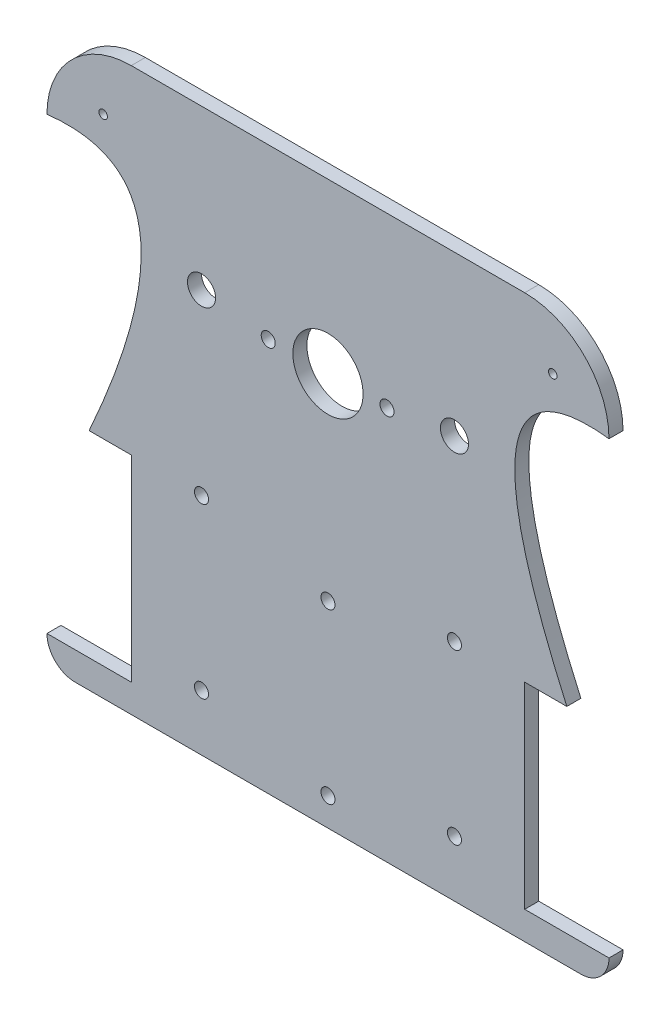
ISO-10303-21;
HEADER;
FILE_DESCRIPTION(('STEP AP214'),'2;1');
FILE_NAME('part.step','',(''),(''),'','','');
FILE_SCHEMA(('AUTOMOTIVE_DESIGN { 1 0 10303 214 1 1 1 1 }'));
ENDSEC;
DATA;
#1=APPLICATION_CONTEXT('core data for automotive mechanical design processes');
#2=APPLICATION_PROTOCOL_DEFINITION('international standard','automotive_design',2000,#1);
#3=PRODUCT_CONTEXT('',#1,'mechanical');
#4=PRODUCT('Part','Part','',(#3));
#5=PRODUCT_RELATED_PRODUCT_CATEGORY('part','',(#4));
#6=PRODUCT_DEFINITION_FORMATION('','',#4);
#7=PRODUCT_DEFINITION_CONTEXT('part definition',#1,'design');
#8=PRODUCT_DEFINITION('design','',#6,#7);
#9=PRODUCT_DEFINITION_SHAPE('','',#8);
#10=(LENGTH_UNIT() NAMED_UNIT(*) SI_UNIT(.MILLI.,.METRE.));
#11=(NAMED_UNIT(*) PLANE_ANGLE_UNIT() SI_UNIT($,.RADIAN.));
#12=(NAMED_UNIT(*) SI_UNIT($,.STERADIAN.) SOLID_ANGLE_UNIT());
#13=UNCERTAINTY_MEASURE_WITH_UNIT(LENGTH_MEASURE(1.E-05),#10,'distance_accuracy_value','');
#14=(GEOMETRIC_REPRESENTATION_CONTEXT(3) GLOBAL_UNCERTAINTY_ASSIGNED_CONTEXT((#13)) GLOBAL_UNIT_ASSIGNED_CONTEXT((#10,
#11,#12)) REPRESENTATION_CONTEXT('',''));
#15=CARTESIAN_POINT('',(0.,0.,0.));
#16=DIRECTION('',(0.,0.,1.));
#17=DIRECTION('',(1.,0.,0.));
#18=AXIS2_PLACEMENT_3D('',#15,#16,#17);
#19=CARTESIAN_POINT('',(90.,-90.,5.));
#20=DIRECTION('',(0.,0.,-1.));
#21=DIRECTION('',(-1.,0.,0.));
#22=AXIS2_PLACEMENT_3D('',#19,#20,#21);
#23=CYLINDRICAL_SURFACE('',#22,9.99999999999999);
#24=CARTESIAN_POINT('',(90.,-90.,0.));
#25=DIRECTION('',(0.,0.,1.));
#26=DIRECTION('',(1.,0.,0.));
#27=AXIS2_PLACEMENT_3D('',#24,#25,#26);
#28=CIRCLE('',#27,9.99999999999999);
#29=CARTESIAN_POINT('',(89.9999999999999,-100.,0.));
#30=VERTEX_POINT('',#29);
#31=CARTESIAN_POINT('',(100.,-90.,0.));
#32=VERTEX_POINT('',#31);
#33=EDGE_CURVE('E172',#30,#32,#28,.T.);
#34=ORIENTED_EDGE('',*,*,#33,.T.);
#35=DIRECTION('',(0.,0.,-1.));
#36=VECTOR('',#35,1.);
#37=CARTESIAN_POINT('',(100.,-89.9999999999999,5.));
#38=LINE('',#37,#36);
#39=CARTESIAN_POINT('',(100.,-90.,5.));
#40=VERTEX_POINT('',#39);
#41=EDGE_CURVE('E11',#40,#32,#38,.T.);
#42=ORIENTED_EDGE('',*,*,#41,.F.);
#43=CARTESIAN_POINT('',(90.,-90.,5.));
#44=DIRECTION('',(0.,0.,1.));
#45=DIRECTION('',(1.,0.,0.));
#46=AXIS2_PLACEMENT_3D('',#43,#44,#45);
#47=CIRCLE('',#46,9.99999999999999);
#48=CARTESIAN_POINT('',(89.9999999999999,-100.,5.));
#49=VERTEX_POINT('',#48);
#50=EDGE_CURVE('E194',#49,#40,#47,.T.);
#51=ORIENTED_EDGE('',*,*,#50,.F.);
#52=DIRECTION('',(0.,0.,-1.));
#53=VECTOR('',#52,1.);
#54=CARTESIAN_POINT('',(89.9999999999999,-100.,5.));
#55=LINE('',#54,#53);
#56=EDGE_CURVE('E209',#49,#30,#55,.T.);
#57=ORIENTED_EDGE('',*,*,#56,.T.);
#58=EDGE_LOOP('',(#34,#42,#51,#57));
#59=FACE_BOUND('',#58,.T.);
#60=ADVANCED_FACE('F33',(#59),#23,.T.);
#61=CARTESIAN_POINT('',(70.,70.,5.));
#62=DIRECTION('',(0.,0.,-1.));
#63=DIRECTION('',(-1.,0.,0.));
#64=AXIS2_PLACEMENT_3D('',#61,#62,#63);
#65=CYLINDRICAL_SURFACE('',#64,30.);
#66=CARTESIAN_POINT('',(70.,70.,0.));
#67=DIRECTION('',(0.,0.,1.));
#68=DIRECTION('',(-1.,0.,0.));
#69=AXIS2_PLACEMENT_3D('',#66,#67,#68);
#70=CIRCLE('',#69,30.);
#71=CARTESIAN_POINT('',(100.,69.9999999999998,0.));
#72=VERTEX_POINT('',#71);
#73=CARTESIAN_POINT('',(69.9999999999998,100.,0.));
#74=VERTEX_POINT('',#73);
#75=EDGE_CURVE('E146',#72,#74,#70,.T.);
#76=ORIENTED_EDGE('',*,*,#75,.T.);
#77=DIRECTION('',(0.,0.,-1.));
#78=VECTOR('',#77,1.);
#79=CARTESIAN_POINT('',(69.9999999999998,100.,5.));
#80=LINE('',#79,#78);
#81=CARTESIAN_POINT('',(69.9999999999998,100.,5.));
#82=VERTEX_POINT('',#81);
#83=EDGE_CURVE('E234',#82,#74,#80,.T.);
#84=ORIENTED_EDGE('',*,*,#83,.F.);
#85=CARTESIAN_POINT('',(70.,70.,5.));
#86=DIRECTION('',(0.,0.,1.));
#87=DIRECTION('',(-1.,0.,0.));
#88=AXIS2_PLACEMENT_3D('',#85,#86,#87);
#89=CIRCLE('',#88,30.);
#90=CARTESIAN_POINT('',(100.,69.9999999999998,5.));
#91=VERTEX_POINT('',#90);
#92=EDGE_CURVE('E197',#91,#82,#89,.T.);
#93=ORIENTED_EDGE('',*,*,#92,.F.);
#94=DIRECTION('',(0.,0.,-1.));
#95=VECTOR('',#94,1.);
#96=CARTESIAN_POINT('',(100.,69.9999999999998,5.));
#97=LINE('',#96,#95);
#98=EDGE_CURVE('E40',#91,#72,#97,.T.);
#99=ORIENTED_EDGE('',*,*,#98,.T.);
#100=EDGE_LOOP('',(#76,#84,#93,#99));
#101=FACE_BOUND('',#100,.T.);
#102=ADVANCED_FACE('F238',(#101),#65,.T.);
#103=CARTESIAN_POINT('',(-69.9999999999998,100.,5.));
#104=DIRECTION('',(0.,-1.,0.));
#105=DIRECTION('',(0.,0.,-1.));
#106=AXIS2_PLACEMENT_3D('',#103,#104,#105);
#107=PLANE('',#106);
#108=DIRECTION('',(-1.,0.,0.));
#109=VECTOR('',#108,1.);
#110=CARTESIAN_POINT('',(-69.9999999999998,100.,0.));
#111=LINE('',#110,#109);
#112=CARTESIAN_POINT('',(-69.9999999999998,100.,0.));
#113=VERTEX_POINT('',#112);
#114=EDGE_CURVE('E213',#74,#113,#111,.T.);
#115=ORIENTED_EDGE('',*,*,#114,.T.);
#116=DIRECTION('',(0.,0.,-1.));
#117=VECTOR('',#116,1.);
#118=CARTESIAN_POINT('',(-69.9999999999998,100.,5.));
#119=LINE('',#118,#117);
#120=CARTESIAN_POINT('',(-69.9999999999998,100.,5.));
#121=VERTEX_POINT('',#120);
#122=EDGE_CURVE('E231',#121,#113,#119,.T.);
#123=ORIENTED_EDGE('',*,*,#122,.F.);
#124=DIRECTION('',(-1.,0.,0.));
#125=VECTOR('',#124,1.);
#126=CARTESIAN_POINT('',(-69.9999999999998,100.,5.));
#127=LINE('',#126,#125);
#128=EDGE_CURVE('E200',#82,#121,#127,.T.);
#129=ORIENTED_EDGE('',*,*,#128,.F.);
#130=ORIENTED_EDGE('',*,*,#83,.T.);
#131=EDGE_LOOP('',(#115,#123,#129,#130));
#132=FACE_BOUND('',#131,.T.);
#133=ADVANCED_FACE('F309',(#132),#107,.F.);
#134=CARTESIAN_POINT('',(-70.,70.,5.));
#135=DIRECTION('',(0.,0.,-1.));
#136=DIRECTION('',(-1.,0.,0.));
#137=AXIS2_PLACEMENT_3D('',#134,#135,#136);
#138=CYLINDRICAL_SURFACE('',#137,30.);
#139=CARTESIAN_POINT('',(-70.,70.,0.));
#140=DIRECTION('',(0.,0.,1.));
#141=DIRECTION('',(-1.,0.,0.));
#142=AXIS2_PLACEMENT_3D('',#139,#140,#141);
#143=CIRCLE('',#142,30.);
#144=CARTESIAN_POINT('',(-100.,69.9999999999998,0.));
#145=VERTEX_POINT('',#144);
#146=EDGE_CURVE('E215',#113,#145,#143,.T.);
#147=ORIENTED_EDGE('',*,*,#146,.T.);
#148=DIRECTION('',(0.,0.,-1.));
#149=VECTOR('',#148,1.);
#150=CARTESIAN_POINT('',(-100.,69.9999999999998,5.));
#151=LINE('',#150,#149);
#152=CARTESIAN_POINT('',(-100.,69.9999999999998,5.));
#153=VERTEX_POINT('',#152);
#154=EDGE_CURVE('E229',#153,#145,#151,.T.);
#155=ORIENTED_EDGE('',*,*,#154,.F.);
#156=CARTESIAN_POINT('',(-70.,70.,5.));
#157=DIRECTION('',(0.,0.,1.));
#158=DIRECTION('',(-1.,0.,0.));
#159=AXIS2_PLACEMENT_3D('',#156,#157,#158);
#160=CIRCLE('',#159,30.);
#161=EDGE_CURVE('E202',#121,#153,#160,.T.);
#162=ORIENTED_EDGE('',*,*,#161,.F.);
#163=ORIENTED_EDGE('',*,*,#122,.T.);
#164=EDGE_LOOP('',(#147,#155,#162,#163));
#165=FACE_BOUND('',#164,.T.);
#166=ADVANCED_FACE('F305',(#165),#138,.T.);
#167=CARTESIAN_POINT('',(-90.,-90.,5.));
#168=DIRECTION('',(0.,0.,-1.));
#169=DIRECTION('',(-1.,0.,0.));
#170=AXIS2_PLACEMENT_3D('',#167,#168,#169);
#171=CYLINDRICAL_SURFACE('',#170,9.99999999999999);
#172=CARTESIAN_POINT('',(-90.,-90.,0.));
#173=DIRECTION('',(0.,0.,1.));
#174=DIRECTION('',(-1.,0.,0.));
#175=AXIS2_PLACEMENT_3D('',#172,#173,#174);
#176=CIRCLE('',#175,9.99999999999999);
#177=CARTESIAN_POINT('',(-99.9999999999999,-90.,0.));
#178=VERTEX_POINT('',#177);
#179=CARTESIAN_POINT('',(-89.9999999999999,-100.,0.));
#180=VERTEX_POINT('',#179);
#181=EDGE_CURVE('E218',#178,#180,#176,.T.);
#182=ORIENTED_EDGE('',*,*,#181,.T.);
#183=DIRECTION('',(0.,0.,-1.));
#184=VECTOR('',#183,1.);
#185=CARTESIAN_POINT('',(-89.9999999999999,-100.,5.));
#186=LINE('',#185,#184);
#187=CARTESIAN_POINT('',(-89.9999999999999,-100.,5.));
#188=VERTEX_POINT('',#187);
#189=EDGE_CURVE('E223',#188,#180,#186,.T.);
#190=ORIENTED_EDGE('',*,*,#189,.F.);
#191=CARTESIAN_POINT('',(-90.,-90.,5.));
#192=DIRECTION('',(0.,0.,1.));
#193=DIRECTION('',(-1.,0.,0.));
#194=AXIS2_PLACEMENT_3D('',#191,#192,#193);
#195=CIRCLE('',#194,9.99999999999999);
#196=CARTESIAN_POINT('',(-99.9999999999999,-90.,5.));
#197=VERTEX_POINT('',#196);
#198=EDGE_CURVE('E205',#197,#188,#195,.T.);
#199=ORIENTED_EDGE('',*,*,#198,.F.);
#200=DIRECTION('',(0.,0.,-1.));
#201=VECTOR('',#200,1.);
#202=CARTESIAN_POINT('',(-100.,-90.,5.));
#203=LINE('',#202,#201);
#204=EDGE_CURVE('E226',#197,#178,#203,.T.);
#205=ORIENTED_EDGE('',*,*,#204,.T.);
#206=EDGE_LOOP('',(#182,#190,#199,#205));
#207=FACE_BOUND('',#206,.T.);
#208=ADVANCED_FACE('F301',(#207),#171,.T.);
#209=CARTESIAN_POINT('',(-89.9999999999999,-100.,5.));
#210=DIRECTION('',(0.,1.,0.));
#211=DIRECTION('',(0.,0.,1.));
#212=AXIS2_PLACEMENT_3D('',#209,#210,#211);
#213=PLANE('',#212);
#214=DIRECTION('',(1.,0.,0.));
#215=VECTOR('',#214,1.);
#216=CARTESIAN_POINT('',(-89.9999999999999,-100.,0.));
#217=LINE('',#216,#215);
#218=EDGE_CURVE('E198',#180,#30,#217,.T.);
#219=ORIENTED_EDGE('',*,*,#218,.T.);
#220=ORIENTED_EDGE('',*,*,#56,.F.);
#221=DIRECTION('',(1.,0.,0.));
#222=VECTOR('',#221,1.);
#223=CARTESIAN_POINT('',(-89.9999999999999,-100.,5.));
#224=LINE('',#223,#222);
#225=EDGE_CURVE('E207',#188,#49,#224,.T.);
#226=ORIENTED_EDGE('',*,*,#225,.F.);
#227=ORIENTED_EDGE('',*,*,#189,.T.);
#228=EDGE_LOOP('',(#219,#220,#226,#227));
#229=FACE_BOUND('',#228,.T.);
#230=ADVANCED_FACE('F294',(#229),#213,.F.);
#231=CARTESIAN_POINT('',(90.,-90.,5.));
#232=DIRECTION('',(0.,0.,1.));
#233=DIRECTION('',(1.,0.,0.));
#234=AXIS2_PLACEMENT_3D('',#231,#232,#233);
#235=PLANE('',#234);
#236=CARTESIAN_POINT('',(-80.,80.,5.));
#237=DIRECTION('',(0.,0.,1.));
#238=DIRECTION('',(1.,0.,0.));
#239=AXIS2_PLACEMENT_3D('',#236,#237,#238);
#240=CIRCLE('',#239,1.5);
#241=CARTESIAN_POINT('',(-78.5,80.,5.));
#242=VERTEX_POINT('',#241);
#243=EDGE_CURVE('E417',#242,#242,#240,.T.);
#244=ORIENTED_EDGE('',*,*,#243,.F.);
#245=EDGE_LOOP('',(#244));
#246=FACE_BOUND('',#245,.T.);
#247=CARTESIAN_POINT('',(80.,80.,5.));
#248=DIRECTION('',(0.,0.,1.));
#249=DIRECTION('',(1.,0.,0.));
#250=AXIS2_PLACEMENT_3D('',#247,#248,#249);
#251=CIRCLE('',#250,1.5);
#252=CARTESIAN_POINT('',(81.5,80.,5.));
#253=VERTEX_POINT('',#252);
#254=EDGE_CURVE('E411',#253,#253,#251,.T.);
#255=ORIENTED_EDGE('',*,*,#254,.F.);
#256=EDGE_LOOP('',(#255));
#257=FACE_BOUND('',#256,.T.);
#258=CARTESIAN_POINT('',(21.,40.,5.));
#259=DIRECTION('',(0.,0.,-1.));
#260=DIRECTION('',(-1.,0.,0.));
#261=AXIS2_PLACEMENT_3D('',#258,#259,#260);
#262=CIRCLE('',#261,2.5);
#263=CARTESIAN_POINT('',(18.5,40.,5.));
#264=VERTEX_POINT('',#263);
#265=EDGE_CURVE('E390',#264,#264,#262,.T.);
#266=ORIENTED_EDGE('',*,*,#265,.T.);
#267=EDGE_LOOP('',(#266));
#268=FACE_BOUND('',#267,.T.);
#269=CARTESIAN_POINT('',(-21.26,40.,5.));
#270=DIRECTION('',(0.,0.,-1.));
#271=DIRECTION('',(-1.,0.,0.));
#272=AXIS2_PLACEMENT_3D('',#269,#270,#271);
#273=CIRCLE('',#272,2.5);
#274=CARTESIAN_POINT('',(-23.76,40.,5.));
#275=VERTEX_POINT('',#274);
#276=EDGE_CURVE('E403',#275,#275,#273,.T.);
#277=ORIENTED_EDGE('',*,*,#276,.T.);
#278=EDGE_LOOP('',(#277));
#279=FACE_BOUND('',#278,.T.);
#280=CARTESIAN_POINT('',(0.,40.,5.));
#281=DIRECTION('',(0.,0.,-1.));
#282=DIRECTION('',(-1.,0.,0.));
#283=AXIS2_PLACEMENT_3D('',#280,#281,#282);
#284=CIRCLE('',#283,12.5);
#285=CARTESIAN_POINT('',(-12.5,40.,5.));
#286=VERTEX_POINT('',#285);
#287=EDGE_CURVE('E396',#286,#286,#284,.T.);
#288=ORIENTED_EDGE('',*,*,#287,.T.);
#289=EDGE_LOOP('',(#288));
#290=FACE_BOUND('',#289,.T.);
#291=CARTESIAN_POINT('',(0.,-90.,5.));
#292=DIRECTION('',(0.,0.,1.));
#293=DIRECTION('',(1.,0.,0.));
#294=AXIS2_PLACEMENT_3D('',#291,#292,#293);
#295=CIRCLE('',#294,2.5);
#296=CARTESIAN_POINT('',(2.5,-90.,5.));
#297=VERTEX_POINT('',#296);
#298=EDGE_CURVE('E387',#297,#297,#295,.T.);
#299=ORIENTED_EDGE('',*,*,#298,.F.);
#300=EDGE_LOOP('',(#299));
#301=FACE_BOUND('',#300,.T.);
#302=CARTESIAN_POINT('',(-45.,43.3509985670117,5.));
#303=DIRECTION('',(0.,0.,1.));
#304=DIRECTION('',(1.,0.,0.));
#305=AXIS2_PLACEMENT_3D('',#302,#303,#304);
#306=CIRCLE('',#305,5.);
#307=CARTESIAN_POINT('',(-40.,43.3509985670117,5.));
#308=VERTEX_POINT('',#307);
#309=EDGE_CURVE('E363',#308,#308,#306,.T.);
#310=ORIENTED_EDGE('',*,*,#309,.F.);
#311=EDGE_LOOP('',(#310));
#312=FACE_BOUND('',#311,.T.);
#313=CARTESIAN_POINT('',(-45.,-20.,5.));
#314=DIRECTION('',(0.,0.,1.));
#315=DIRECTION('',(-1.,0.,0.));
#316=AXIS2_PLACEMENT_3D('',#313,#314,#315);
#317=CIRCLE('',#316,2.5);
#318=CARTESIAN_POINT('',(-47.5,-20.,5.));
#319=VERTEX_POINT('',#318);
#320=EDGE_CURVE('E370',#319,#319,#317,.T.);
#321=ORIENTED_EDGE('',*,*,#320,.F.);
#322=EDGE_LOOP('',(#321));
#323=FACE_BOUND('',#322,.T.);
#324=CARTESIAN_POINT('',(45.,-20.,5.));
#325=DIRECTION('',(0.,0.,1.));
#326=DIRECTION('',(-1.,0.,0.));
#327=AXIS2_PLACEMENT_3D('',#324,#325,#326);
#328=CIRCLE('',#327,2.5);
#329=CARTESIAN_POINT('',(42.5,-20.,5.));
#330=VERTEX_POINT('',#329);
#331=EDGE_CURVE('E351',#330,#330,#328,.T.);
#332=ORIENTED_EDGE('',*,*,#331,.F.);
#333=EDGE_LOOP('',(#332));
#334=FACE_BOUND('',#333,.T.);
#335=CARTESIAN_POINT('',(-45.,-80.,5.));
#336=DIRECTION('',(0.,0.,1.));
#337=DIRECTION('',(1.,0.,0.));
#338=AXIS2_PLACEMENT_3D('',#335,#336,#337);
#339=CIRCLE('',#338,2.5);
#340=CARTESIAN_POINT('',(-42.5,-80.,5.));
#341=VERTEX_POINT('',#340);
#342=EDGE_CURVE('E358',#341,#341,#339,.T.);
#343=ORIENTED_EDGE('',*,*,#342,.F.);
#344=EDGE_LOOP('',(#343));
#345=FACE_BOUND('',#344,.T.);
#346=CARTESIAN_POINT('',(45.,43.3509985670117,5.));
#347=DIRECTION('',(0.,0.,1.));
#348=DIRECTION('',(-1.,0.,0.));
#349=AXIS2_PLACEMENT_3D('',#346,#347,#348);
#350=CIRCLE('',#349,5.);
#351=CARTESIAN_POINT('',(40.,43.3509985670117,5.));
#352=VERTEX_POINT('',#351);
#353=EDGE_CURVE('E382',#352,#352,#350,.T.);
#354=ORIENTED_EDGE('',*,*,#353,.F.);
#355=EDGE_LOOP('',(#354));
#356=FACE_BOUND('',#355,.T.);
#357=CARTESIAN_POINT('',(0.,-30.,5.));
#358=DIRECTION('',(0.,0.,1.));
#359=DIRECTION('',(1.,0.,0.));
#360=AXIS2_PLACEMENT_3D('',#357,#358,#359);
#361=CIRCLE('',#360,2.5);
#362=CARTESIAN_POINT('',(2.5,-30.,5.));
#363=VERTEX_POINT('',#362);
#364=EDGE_CURVE('E375',#363,#363,#361,.T.);
#365=ORIENTED_EDGE('',*,*,#364,.F.);
#366=EDGE_LOOP('',(#365));
#367=FACE_BOUND('',#366,.T.);
#368=CARTESIAN_POINT('',(45.,-80.,5.));
#369=DIRECTION('',(0.,0.,1.));
#370=DIRECTION('',(1.,0.,0.));
#371=AXIS2_PLACEMENT_3D('',#368,#369,#370);
#372=CIRCLE('',#371,2.5);
#373=CARTESIAN_POINT('',(47.5,-80.,5.));
#374=VERTEX_POINT('',#373);
#375=EDGE_CURVE('E344',#374,#374,#372,.T.);
#376=ORIENTED_EDGE('',*,*,#375,.F.);
#377=EDGE_LOOP('',(#376));
#378=FACE_BOUND('',#377,.T.);
#379=CARTESIAN_POINT('',(100.,69.9999999999998,5.));
#380=CARTESIAN_POINT('',(41.5627507887384,76.7696481561118,5.));
#381=CARTESIAN_POINT('',(85.,-20.,5.));
#382=B_SPLINE_CURVE_WITH_KNOTS('',2,(#379,#380,#381),.UNSPECIFIED.,.F.,.F.,(3,3),(0.,1.),.UNSPECIFIED.);
#383=CARTESIAN_POINT('',(85.,-20.,5.));
#384=VERTEX_POINT('',#383);
#385=EDGE_CURVE('E55',#91,#384,#382,.T.);
#386=ORIENTED_EDGE('',*,*,#385,.F.);
#387=ORIENTED_EDGE('',*,*,#92,.T.);
#388=ORIENTED_EDGE('',*,*,#128,.T.);
#389=ORIENTED_EDGE('',*,*,#161,.T.);
#390=CARTESIAN_POINT('',(-85.,-20.,5.));
#391=CARTESIAN_POINT('',(-41.5627507887384,76.7696481561117,5.));
#392=CARTESIAN_POINT('',(-100.,69.9999999999998,5.));
#393=B_SPLINE_CURVE_WITH_KNOTS('',2,(#390,#391,#392),.UNSPECIFIED.,.F.,.F.,(3,3),(0.,1.),.UNSPECIFIED.);
#394=CARTESIAN_POINT('',(-85.,-20.,5.));
#395=VERTEX_POINT('',#394);
#396=EDGE_CURVE('E257',#395,#153,#393,.T.);
#397=ORIENTED_EDGE('',*,*,#396,.F.);
#398=DIRECTION('',(-1.,0.,0.));
#399=VECTOR('',#398,1.);
#400=CARTESIAN_POINT('',(-100.,-20.,5.));
#401=LINE('',#400,#399);
#402=CARTESIAN_POINT('',(-70.,-20.,5.));
#403=VERTEX_POINT('',#402);
#404=EDGE_CURVE('E187',#403,#395,#401,.T.);
#405=ORIENTED_EDGE('',*,*,#404,.F.);
#406=DIRECTION('',(0.,1.,0.));
#407=VECTOR('',#406,1.);
#408=CARTESIAN_POINT('',(-70.,-20.,5.));
#409=LINE('',#408,#407);
#410=CARTESIAN_POINT('',(-70.,-90.,5.));
#411=VERTEX_POINT('',#410);
#412=EDGE_CURVE('E137',#411,#403,#409,.T.);
#413=ORIENTED_EDGE('',*,*,#412,.F.);
#414=DIRECTION('',(1.,0.,0.));
#415=VECTOR('',#414,1.);
#416=CARTESIAN_POINT('',(-70.,-90.,5.));
#417=LINE('',#416,#415);
#418=EDGE_CURVE('E178',#197,#411,#417,.T.);
#419=ORIENTED_EDGE('',*,*,#418,.F.);
#420=ORIENTED_EDGE('',*,*,#198,.T.);
#421=ORIENTED_EDGE('',*,*,#225,.T.);
#422=ORIENTED_EDGE('',*,*,#50,.T.);
#423=DIRECTION('',(1.,0.,0.));
#424=VECTOR('',#423,1.);
#425=CARTESIAN_POINT('',(70.,-90.,5.));
#426=LINE('',#425,#424);
#427=CARTESIAN_POINT('',(70.,-90.,5.));
#428=VERTEX_POINT('',#427);
#429=EDGE_CURVE('E153',#428,#40,#426,.T.);
#430=ORIENTED_EDGE('',*,*,#429,.F.);
#431=DIRECTION('',(0.,-1.,0.));
#432=VECTOR('',#431,1.);
#433=CARTESIAN_POINT('',(70.,-20.,5.));
#434=LINE('',#433,#432);
#435=CARTESIAN_POINT('',(70.,-20.,5.));
#436=VERTEX_POINT('',#435);
#437=EDGE_CURVE('E157',#436,#428,#434,.T.);
#438=ORIENTED_EDGE('',*,*,#437,.F.);
#439=DIRECTION('',(-1.,0.,0.));
#440=VECTOR('',#439,1.);
#441=CARTESIAN_POINT('',(100.,-20.,5.));
#442=LINE('',#441,#440);
#443=EDGE_CURVE('E165',#384,#436,#442,.T.);
#444=ORIENTED_EDGE('',*,*,#443,.F.);
#445=EDGE_LOOP('',(#386,#387,#388,#389,#397,#405,#413,#419,#420,#421,#422,#430,#438,#444));
#446=FACE_BOUND('',#445,.T.);
#447=ADVANCED_FACE('F241',(#246,#257,#268,#279,#290,#301,#312,#323,#334,#345,#356,#367,#378,
#446),#235,.T.);
#448=CARTESIAN_POINT('',(90.,-90.,0.));
#449=DIRECTION('',(0.,0.,1.));
#450=DIRECTION('',(1.,0.,0.));
#451=AXIS2_PLACEMENT_3D('',#448,#449,#450);
#452=PLANE('',#451);
#453=CARTESIAN_POINT('',(-80.,80.,0.));
#454=DIRECTION('',(0.,0.,1.));
#455=DIRECTION('',(1.,0.,0.));
#456=AXIS2_PLACEMENT_3D('',#453,#454,#455);
#457=CIRCLE('',#456,1.5);
#458=CARTESIAN_POINT('',(-78.5,80.,0.));
#459=VERTEX_POINT('',#458);
#460=EDGE_CURVE('E397',#459,#459,#457,.T.);
#461=ORIENTED_EDGE('',*,*,#460,.T.);
#462=EDGE_LOOP('',(#461));
#463=FACE_BOUND('',#462,.T.);
#464=CARTESIAN_POINT('',(80.,80.,0.));
#465=DIRECTION('',(0.,0.,1.));
#466=DIRECTION('',(1.,0.,0.));
#467=AXIS2_PLACEMENT_3D('',#464,#465,#466);
#468=CIRCLE('',#467,1.5);
#469=CARTESIAN_POINT('',(81.5,80.,0.));
#470=VERTEX_POINT('',#469);
#471=EDGE_CURVE('E414',#470,#470,#468,.T.);
#472=ORIENTED_EDGE('',*,*,#471,.T.);
#473=EDGE_LOOP('',(#472));
#474=FACE_BOUND('',#473,.T.);
#475=CARTESIAN_POINT('',(21.,40.,0.));
#476=DIRECTION('',(0.,0.,-1.));
#477=DIRECTION('',(-1.,0.,0.));
#478=AXIS2_PLACEMENT_3D('',#475,#476,#477);
#479=CIRCLE('',#478,2.5);
#480=CARTESIAN_POINT('',(18.5,40.,0.));
#481=VERTEX_POINT('',#480);
#482=EDGE_CURVE('E406',#481,#481,#479,.T.);
#483=ORIENTED_EDGE('',*,*,#482,.F.);
#484=EDGE_LOOP('',(#483));
#485=FACE_BOUND('',#484,.T.);
#486=CARTESIAN_POINT('',(-21.26,40.,0.));
#487=DIRECTION('',(0.,0.,-1.));
#488=DIRECTION('',(-1.,0.,0.));
#489=AXIS2_PLACEMENT_3D('',#486,#487,#488);
#490=CIRCLE('',#489,2.5);
#491=CARTESIAN_POINT('',(-23.76,40.,0.));
#492=VERTEX_POINT('',#491);
#493=EDGE_CURVE('E400',#492,#492,#490,.T.);
#494=ORIENTED_EDGE('',*,*,#493,.F.);
#495=EDGE_LOOP('',(#494));
#496=FACE_BOUND('',#495,.T.);
#497=CARTESIAN_POINT('',(0.,40.,0.));
#498=DIRECTION('',(0.,0.,-1.));
#499=DIRECTION('',(-1.,0.,0.));
#500=AXIS2_PLACEMENT_3D('',#497,#498,#499);
#501=CIRCLE('',#500,12.5);
#502=CARTESIAN_POINT('',(-12.5,40.,0.));
#503=VERTEX_POINT('',#502);
#504=EDGE_CURVE('E393',#503,#503,#501,.T.);
#505=ORIENTED_EDGE('',*,*,#504,.F.);
#506=EDGE_LOOP('',(#505));
#507=FACE_BOUND('',#506,.T.);
#508=CARTESIAN_POINT('',(0.,-90.,0.));
#509=DIRECTION('',(0.,0.,1.));
#510=DIRECTION('',(1.,0.,0.));
#511=AXIS2_PLACEMENT_3D('',#508,#509,#510);
#512=CIRCLE('',#511,2.5);
#513=CARTESIAN_POINT('',(2.5,-90.,0.));
#514=VERTEX_POINT('',#513);
#515=EDGE_CURVE('E379',#514,#514,#512,.T.);
#516=ORIENTED_EDGE('',*,*,#515,.T.);
#517=EDGE_LOOP('',(#516));
#518=FACE_BOUND('',#517,.T.);
#519=CARTESIAN_POINT('',(-45.,43.3509985670117,0.));
#520=DIRECTION('',(0.,0.,1.));
#521=DIRECTION('',(1.,0.,0.));
#522=AXIS2_PLACEMENT_3D('',#519,#520,#521);
#523=CIRCLE('',#522,5.);
#524=CARTESIAN_POINT('',(-40.,43.3509985670117,0.));
#525=VERTEX_POINT('',#524);
#526=EDGE_CURVE('E366',#525,#525,#523,.T.);
#527=ORIENTED_EDGE('',*,*,#526,.T.);
#528=EDGE_LOOP('',(#527));
#529=FACE_BOUND('',#528,.T.);
#530=CARTESIAN_POINT('',(-45.,-20.,0.));
#531=DIRECTION('',(0.,0.,1.));
#532=DIRECTION('',(-1.,0.,0.));
#533=AXIS2_PLACEMENT_3D('',#530,#531,#532);
#534=CIRCLE('',#533,2.5);
#535=CARTESIAN_POINT('',(-47.5,-20.,0.));
#536=VERTEX_POINT('',#535);
#537=EDGE_CURVE('E355',#536,#536,#534,.T.);
#538=ORIENTED_EDGE('',*,*,#537,.T.);
#539=EDGE_LOOP('',(#538));
#540=FACE_BOUND('',#539,.T.);
#541=CARTESIAN_POINT('',(45.,-20.,0.));
#542=DIRECTION('',(0.,0.,1.));
#543=DIRECTION('',(-1.,0.,0.));
#544=AXIS2_PLACEMENT_3D('',#541,#542,#543);
#545=CIRCLE('',#544,2.5);
#546=CARTESIAN_POINT('',(42.5,-20.,0.));
#547=VERTEX_POINT('',#546);
#548=EDGE_CURVE('E354',#547,#547,#545,.T.);
#549=ORIENTED_EDGE('',*,*,#548,.T.);
#550=EDGE_LOOP('',(#549));
#551=FACE_BOUND('',#550,.T.);
#552=CARTESIAN_POINT('',(-45.,-80.,0.));
#553=DIRECTION('',(0.,0.,1.));
#554=DIRECTION('',(1.,0.,0.));
#555=AXIS2_PLACEMENT_3D('',#552,#553,#554);
#556=CIRCLE('',#555,2.5);
#557=CARTESIAN_POINT('',(-42.5,-80.,0.));
#558=VERTEX_POINT('',#557);
#559=EDGE_CURVE('E349',#558,#558,#556,.T.);
#560=ORIENTED_EDGE('',*,*,#559,.T.);
#561=EDGE_LOOP('',(#560));
#562=FACE_BOUND('',#561,.T.);
#563=CARTESIAN_POINT('',(45.,43.3509985670117,0.));
#564=DIRECTION('',(0.,0.,1.));
#565=DIRECTION('',(-1.,0.,0.));
#566=AXIS2_PLACEMENT_3D('',#563,#564,#565);
#567=CIRCLE('',#566,5.);
#568=CARTESIAN_POINT('',(40.,43.3509985670117,0.));
#569=VERTEX_POINT('',#568);
#570=EDGE_CURVE('E367',#569,#569,#567,.T.);
#571=ORIENTED_EDGE('',*,*,#570,.T.);
#572=EDGE_LOOP('',(#571));
#573=FACE_BOUND('',#572,.T.);
#574=CARTESIAN_POINT('',(0.,-30.,0.));
#575=DIRECTION('',(0.,0.,1.));
#576=DIRECTION('',(1.,0.,0.));
#577=AXIS2_PLACEMENT_3D('',#574,#575,#576);
#578=CIRCLE('',#577,2.5);
#579=CARTESIAN_POINT('',(2.5,-30.,0.));
#580=VERTEX_POINT('',#579);
#581=EDGE_CURVE('E378',#580,#580,#578,.T.);
#582=ORIENTED_EDGE('',*,*,#581,.T.);
#583=EDGE_LOOP('',(#582));
#584=FACE_BOUND('',#583,.T.);
#585=CARTESIAN_POINT('',(45.,-80.,0.));
#586=DIRECTION('',(0.,0.,1.));
#587=DIRECTION('',(1.,0.,0.));
#588=AXIS2_PLACEMENT_3D('',#585,#586,#587);
#589=CIRCLE('',#588,2.5);
#590=CARTESIAN_POINT('',(47.5,-80.,0.));
#591=VERTEX_POINT('',#590);
#592=EDGE_CURVE('E342',#591,#591,#589,.T.);
#593=ORIENTED_EDGE('',*,*,#592,.T.);
#594=EDGE_LOOP('',(#593));
#595=FACE_BOUND('',#594,.T.);
#596=ORIENTED_EDGE('',*,*,#75,.F.);
#597=CARTESIAN_POINT('',(100.,69.9999999999998,0.));
#598=CARTESIAN_POINT('',(41.5627507887384,76.7696481561118,0.));
#599=CARTESIAN_POINT('',(85.,-20.,0.));
#600=B_SPLINE_CURVE_WITH_KNOTS('',2,(#597,#598,#599),.UNSPECIFIED.,.F.,.F.,(3,3),(0.,1.),.UNSPECIFIED.);
#601=CARTESIAN_POINT('',(85.,-20.,0.));
#602=VERTEX_POINT('',#601);
#603=EDGE_CURVE('E132',#72,#602,#600,.T.);
#604=ORIENTED_EDGE('',*,*,#603,.T.);
#605=DIRECTION('',(-1.,0.,0.));
#606=VECTOR('',#605,1.);
#607=CARTESIAN_POINT('',(100.,-20.,0.));
#608=LINE('',#607,#606);
#609=CARTESIAN_POINT('',(70.,-20.,0.));
#610=VERTEX_POINT('',#609);
#611=EDGE_CURVE('E143',#602,#610,#608,.T.);
#612=ORIENTED_EDGE('',*,*,#611,.T.);
#613=DIRECTION('',(0.,-1.,0.));
#614=VECTOR('',#613,1.);
#615=CARTESIAN_POINT('',(70.,-20.,0.));
#616=LINE('',#615,#614);
#617=CARTESIAN_POINT('',(70.,-90.,0.));
#618=VERTEX_POINT('',#617);
#619=EDGE_CURVE('E152',#610,#618,#616,.T.);
#620=ORIENTED_EDGE('',*,*,#619,.T.);
#621=DIRECTION('',(1.,0.,0.));
#622=VECTOR('',#621,1.);
#623=CARTESIAN_POINT('',(70.,-90.,0.));
#624=LINE('',#623,#622);
#625=EDGE_CURVE('E155',#618,#32,#624,.T.);
#626=ORIENTED_EDGE('',*,*,#625,.T.);
#627=ORIENTED_EDGE('',*,*,#33,.F.);
#628=ORIENTED_EDGE('',*,*,#218,.F.);
#629=ORIENTED_EDGE('',*,*,#181,.F.);
#630=DIRECTION('',(1.,0.,0.));
#631=VECTOR('',#630,1.);
#632=CARTESIAN_POINT('',(-70.,-90.,0.));
#633=LINE('',#632,#631);
#634=CARTESIAN_POINT('',(-70.,-90.,0.));
#635=VERTEX_POINT('',#634);
#636=EDGE_CURVE('E181',#178,#635,#633,.T.);
#637=ORIENTED_EDGE('',*,*,#636,.T.);
#638=DIRECTION('',(0.,1.,0.));
#639=VECTOR('',#638,1.);
#640=CARTESIAN_POINT('',(-70.,-20.,0.));
#641=LINE('',#640,#639);
#642=CARTESIAN_POINT('',(-70.,-20.,0.));
#643=VERTEX_POINT('',#642);
#644=EDGE_CURVE('E174',#635,#643,#641,.T.);
#645=ORIENTED_EDGE('',*,*,#644,.T.);
#646=DIRECTION('',(-1.,0.,0.));
#647=VECTOR('',#646,1.);
#648=CARTESIAN_POINT('',(-100.,-20.,0.));
#649=LINE('',#648,#647);
#650=CARTESIAN_POINT('',(-85.,-20.,0.));
#651=VERTEX_POINT('',#650);
#652=EDGE_CURVE('E177',#643,#651,#649,.T.);
#653=ORIENTED_EDGE('',*,*,#652,.T.);
#654=CARTESIAN_POINT('',(-85.,-20.,0.));
#655=CARTESIAN_POINT('',(-41.5627507887384,76.7696481561117,0.));
#656=CARTESIAN_POINT('',(-100.,69.9999999999998,0.));
#657=B_SPLINE_CURVE_WITH_KNOTS('',2,(#654,#655,#656),.UNSPECIFIED.,.F.,.F.,(3,3),(0.,1.),.UNSPECIFIED.);
#658=EDGE_CURVE('E47',#651,#145,#657,.T.);
#659=ORIENTED_EDGE('',*,*,#658,.T.);
#660=ORIENTED_EDGE('',*,*,#146,.F.);
#661=ORIENTED_EDGE('',*,*,#114,.F.);
#662=EDGE_LOOP('',(#596,#604,#612,#620,#626,#627,#628,#629,#637,#645,#653,#659,#660,#661));
#663=FACE_BOUND('',#662,.T.);
#664=ADVANCED_FACE('F141',(#463,#474,#485,#496,#507,#518,#529,#540,#551,#562,#573,#584,#595,
#663),#452,.F.);
#665=CARTESIAN_POINT('',(-70.,-20.,0.));
#666=DIRECTION('',(1.,0.,0.));
#667=DIRECTION('',(0.,1.,0.));
#668=AXIS2_PLACEMENT_3D('',#665,#666,#667);
#669=PLANE('',#668);
#670=ORIENTED_EDGE('',*,*,#412,.T.);
#671=DIRECTION('',(0.,0.,1.));
#672=VECTOR('',#671,1.);
#673=CARTESIAN_POINT('',(-70.,-20.,0.));
#674=LINE('',#673,#672);
#675=EDGE_CURVE('E184',#643,#403,#674,.T.);
#676=ORIENTED_EDGE('',*,*,#675,.F.);
#677=ORIENTED_EDGE('',*,*,#644,.F.);
#678=DIRECTION('',(0.,0.,1.));
#679=VECTOR('',#678,1.);
#680=CARTESIAN_POINT('',(-70.,-90.,0.));
#681=LINE('',#680,#679);
#682=EDGE_CURVE('E167',#635,#411,#681,.T.);
#683=ORIENTED_EDGE('',*,*,#682,.T.);
#684=EDGE_LOOP('',(#670,#676,#677,#683));
#685=FACE_BOUND('',#684,.T.);
#686=ADVANCED_FACE('F284',(#685),#669,.F.);
#687=CARTESIAN_POINT('',(-70.,-90.,0.));
#688=DIRECTION('',(0.,-1.,0.));
#689=DIRECTION('',(1.,0.,0.));
#690=AXIS2_PLACEMENT_3D('',#687,#688,#689);
#691=PLANE('',#690);
#692=ORIENTED_EDGE('',*,*,#418,.T.);
#693=ORIENTED_EDGE('',*,*,#682,.F.);
#694=ORIENTED_EDGE('',*,*,#636,.F.);
#695=ORIENTED_EDGE('',*,*,#204,.F.);
#696=EDGE_LOOP('',(#692,#693,#694,#695));
#697=FACE_BOUND('',#696,.T.);
#698=ADVANCED_FACE('F281',(#697),#691,.F.);
#699=CARTESIAN_POINT('',(-100.,-20.,0.));
#700=DIRECTION('',(0.,1.,0.));
#701=DIRECTION('',(0.,0.,1.));
#702=AXIS2_PLACEMENT_3D('',#699,#700,#701);
#703=PLANE('',#702);
#704=ORIENTED_EDGE('',*,*,#404,.T.);
#705=DIRECTION('',(0.,0.,1.));
#706=VECTOR('',#705,1.);
#707=CARTESIAN_POINT('',(-85.,-20.,0.));
#708=LINE('',#707,#706);
#709=EDGE_CURVE('E160',#651,#395,#708,.T.);
#710=ORIENTED_EDGE('',*,*,#709,.F.);
#711=ORIENTED_EDGE('',*,*,#652,.F.);
#712=ORIENTED_EDGE('',*,*,#675,.T.);
#713=EDGE_LOOP('',(#704,#710,#711,#712));
#714=FACE_BOUND('',#713,.T.);
#715=ADVANCED_FACE('F274',(#714),#703,.F.);
#716=CARTESIAN_POINT('',(70.,-90.,0.));
#717=DIRECTION('',(0.,-1.,0.));
#718=DIRECTION('',(0.,0.,-1.));
#719=AXIS2_PLACEMENT_3D('',#716,#717,#718);
#720=PLANE('',#719);
#721=ORIENTED_EDGE('',*,*,#429,.T.);
#722=ORIENTED_EDGE('',*,*,#41,.T.);
#723=ORIENTED_EDGE('',*,*,#625,.F.);
#724=DIRECTION('',(0.,0.,1.));
#725=VECTOR('',#724,1.);
#726=CARTESIAN_POINT('',(70.,-90.,0.));
#727=LINE('',#726,#725);
#728=EDGE_CURVE('E170',#618,#428,#727,.T.);
#729=ORIENTED_EDGE('',*,*,#728,.T.);
#730=EDGE_LOOP('',(#721,#722,#723,#729));
#731=FACE_BOUND('',#730,.T.);
#732=ADVANCED_FACE('F270',(#731),#720,.F.);
#733=CARTESIAN_POINT('',(70.,-20.,0.));
#734=DIRECTION('',(-1.,0.,0.));
#735=DIRECTION('',(0.,-1.,0.));
#736=AXIS2_PLACEMENT_3D('',#733,#734,#735);
#737=PLANE('',#736);
#738=ORIENTED_EDGE('',*,*,#437,.T.);
#739=ORIENTED_EDGE('',*,*,#728,.F.);
#740=ORIENTED_EDGE('',*,*,#619,.F.);
#741=DIRECTION('',(0.,0.,1.));
#742=VECTOR('',#741,1.);
#743=CARTESIAN_POINT('',(70.,-20.,0.));
#744=LINE('',#743,#742);
#745=EDGE_CURVE('E151',#610,#436,#744,.T.);
#746=ORIENTED_EDGE('',*,*,#745,.T.);
#747=EDGE_LOOP('',(#738,#739,#740,#746));
#748=FACE_BOUND('',#747,.T.);
#749=ADVANCED_FACE('F273',(#748),#737,.F.);
#750=CARTESIAN_POINT('',(100.,-20.,0.));
#751=DIRECTION('',(0.,1.,0.));
#752=DIRECTION('',(-1.,0.,0.));
#753=AXIS2_PLACEMENT_3D('',#750,#751,#752);
#754=PLANE('',#753);
#755=ORIENTED_EDGE('',*,*,#611,.F.);
#756=DIRECTION('',(0.,0.,1.));
#757=VECTOR('',#756,1.);
#758=CARTESIAN_POINT('',(85.,-20.,0.));
#759=LINE('',#758,#757);
#760=EDGE_CURVE('E129',#602,#384,#759,.T.);
#761=ORIENTED_EDGE('',*,*,#760,.T.);
#762=ORIENTED_EDGE('',*,*,#443,.T.);
#763=ORIENTED_EDGE('',*,*,#745,.F.);
#764=EDGE_LOOP('',(#755,#761,#762,#763));
#765=FACE_BOUND('',#764,.T.);
#766=ADVANCED_FACE('F149',(#765),#754,.F.);
#767=DIRECTION('',(0.,0.,1.));
#768=VECTOR('',#767,1.);
#769=SURFACE_OF_LINEAR_EXTRUSION('',#600,#768);
#770=ORIENTED_EDGE('',*,*,#385,.T.);
#771=ORIENTED_EDGE('',*,*,#760,.F.);
#772=ORIENTED_EDGE('',*,*,#603,.F.);
#773=ORIENTED_EDGE('',*,*,#98,.F.);
#774=EDGE_LOOP('',(#770,#771,#772,#773));
#775=FACE_BOUND('',#774,.T.);
#776=ADVANCED_FACE('F131',(#775),#769,.F.);
#777=DIRECTION('',(0.,0.,1.));
#778=VECTOR('',#777,1.);
#779=SURFACE_OF_LINEAR_EXTRUSION('',#657,#778);
#780=ORIENTED_EDGE('',*,*,#396,.T.);
#781=ORIENTED_EDGE('',*,*,#154,.T.);
#782=ORIENTED_EDGE('',*,*,#658,.F.);
#783=ORIENTED_EDGE('',*,*,#709,.T.);
#784=EDGE_LOOP('',(#780,#781,#782,#783));
#785=FACE_BOUND('',#784,.T.);
#786=ADVANCED_FACE('F264',(#785),#779,.F.);
#787=CARTESIAN_POINT('',(45.,-80.,0.));
#788=DIRECTION('',(0.,0.,1.));
#789=DIRECTION('',(1.,0.,0.));
#790=AXIS2_PLACEMENT_3D('',#787,#788,#789);
#791=CYLINDRICAL_SURFACE('',#790,2.5);
#792=ORIENTED_EDGE('',*,*,#592,.F.);
#793=EDGE_LOOP('',(#792));
#794=FACE_BOUND('',#793,.T.);
#795=ORIENTED_EDGE('',*,*,#375,.T.);
#796=EDGE_LOOP('',(#795));
#797=FACE_BOUND('',#796,.T.);
#798=ADVANCED_FACE('F268',(#794,#797),#791,.F.);
#799=CARTESIAN_POINT('',(0.,-30.,0.));
#800=DIRECTION('',(0.,0.,1.));
#801=DIRECTION('',(1.,0.,0.));
#802=AXIS2_PLACEMENT_3D('',#799,#800,#801);
#803=CYLINDRICAL_SURFACE('',#802,2.5);
#804=ORIENTED_EDGE('',*,*,#581,.F.);
#805=EDGE_LOOP('',(#804));
#806=FACE_BOUND('',#805,.T.);
#807=ORIENTED_EDGE('',*,*,#364,.T.);
#808=EDGE_LOOP('',(#807));
#809=FACE_BOUND('',#808,.T.);
#810=ADVANCED_FACE('F456',(#806,#809),#803,.F.);
#811=CARTESIAN_POINT('',(45.,43.3509985670117,0.));
#812=DIRECTION('',(0.,0.,1.));
#813=DIRECTION('',(1.,0.,0.));
#814=AXIS2_PLACEMENT_3D('',#811,#812,#813);
#815=CYLINDRICAL_SURFACE('',#814,5.);
#816=ORIENTED_EDGE('',*,*,#570,.F.);
#817=EDGE_LOOP('',(#816));
#818=FACE_BOUND('',#817,.T.);
#819=ORIENTED_EDGE('',*,*,#353,.T.);
#820=EDGE_LOOP('',(#819));
#821=FACE_BOUND('',#820,.T.);
#822=ADVANCED_FACE('F461',(#818,#821),#815,.F.);
#823=CARTESIAN_POINT('',(-45.,-80.,0.));
#824=DIRECTION('',(0.,0.,1.));
#825=DIRECTION('',(1.,0.,0.));
#826=AXIS2_PLACEMENT_3D('',#823,#824,#825);
#827=CYLINDRICAL_SURFACE('',#826,2.5);
#828=ORIENTED_EDGE('',*,*,#559,.F.);
#829=EDGE_LOOP('',(#828));
#830=FACE_BOUND('',#829,.T.);
#831=ORIENTED_EDGE('',*,*,#342,.T.);
#832=EDGE_LOOP('',(#831));
#833=FACE_BOUND('',#832,.T.);
#834=ADVANCED_FACE('F469',(#830,#833),#827,.F.);
#835=CARTESIAN_POINT('',(45.,-20.,0.));
#836=DIRECTION('',(0.,0.,1.));
#837=DIRECTION('',(1.,0.,0.));
#838=AXIS2_PLACEMENT_3D('',#835,#836,#837);
#839=CYLINDRICAL_SURFACE('',#838,2.5);
#840=ORIENTED_EDGE('',*,*,#548,.F.);
#841=EDGE_LOOP('',(#840));
#842=FACE_BOUND('',#841,.T.);
#843=ORIENTED_EDGE('',*,*,#331,.T.);
#844=EDGE_LOOP('',(#843));
#845=FACE_BOUND('',#844,.T.);
#846=ADVANCED_FACE('F465',(#842,#845),#839,.F.);
#847=CARTESIAN_POINT('',(-45.,-20.,0.));
#848=DIRECTION('',(0.,0.,1.));
#849=DIRECTION('',(1.,0.,0.));
#850=AXIS2_PLACEMENT_3D('',#847,#848,#849);
#851=CYLINDRICAL_SURFACE('',#850,2.5);
#852=ORIENTED_EDGE('',*,*,#537,.F.);
#853=EDGE_LOOP('',(#852));
#854=FACE_BOUND('',#853,.T.);
#855=ORIENTED_EDGE('',*,*,#320,.T.);
#856=EDGE_LOOP('',(#855));
#857=FACE_BOUND('',#856,.T.);
#858=ADVANCED_FACE('F468',(#854,#857),#851,.F.);
#859=CARTESIAN_POINT('',(-45.,43.3509985670117,0.));
#860=DIRECTION('',(0.,0.,1.));
#861=DIRECTION('',(1.,0.,0.));
#862=AXIS2_PLACEMENT_3D('',#859,#860,#861);
#863=CYLINDRICAL_SURFACE('',#862,5.);
#864=ORIENTED_EDGE('',*,*,#526,.F.);
#865=EDGE_LOOP('',(#864));
#866=FACE_BOUND('',#865,.T.);
#867=ORIENTED_EDGE('',*,*,#309,.T.);
#868=EDGE_LOOP('',(#867));
#869=FACE_BOUND('',#868,.T.);
#870=ADVANCED_FACE('F474',(#866,#869),#863,.F.);
#871=CARTESIAN_POINT('',(0.,-90.,0.));
#872=DIRECTION('',(0.,0.,1.));
#873=DIRECTION('',(1.,0.,0.));
#874=AXIS2_PLACEMENT_3D('',#871,#872,#873);
#875=CYLINDRICAL_SURFACE('',#874,2.5);
#876=ORIENTED_EDGE('',*,*,#515,.F.);
#877=EDGE_LOOP('',(#876));
#878=FACE_BOUND('',#877,.T.);
#879=ORIENTED_EDGE('',*,*,#298,.T.);
#880=EDGE_LOOP('',(#879));
#881=FACE_BOUND('',#880,.T.);
#882=ADVANCED_FACE('F477',(#878,#881),#875,.F.);
#883=CARTESIAN_POINT('',(0.,40.,5.));
#884=DIRECTION('',(0.,0.,-1.));
#885=DIRECTION('',(-1.,0.,0.));
#886=AXIS2_PLACEMENT_3D('',#883,#884,#885);
#887=CYLINDRICAL_SURFACE('',#886,12.5);
#888=ORIENTED_EDGE('',*,*,#287,.F.);
#889=EDGE_LOOP('',(#888));
#890=FACE_BOUND('',#889,.T.);
#891=ORIENTED_EDGE('',*,*,#504,.T.);
#892=EDGE_LOOP('',(#891));
#893=FACE_BOUND('',#892,.T.);
#894=ADVANCED_FACE('F487',(#890,#893),#887,.F.);
#895=CARTESIAN_POINT('',(-21.26,40.,5.));
#896=DIRECTION('',(0.,0.,-1.));
#897=DIRECTION('',(-1.,0.,0.));
#898=AXIS2_PLACEMENT_3D('',#895,#896,#897);
#899=CYLINDRICAL_SURFACE('',#898,2.5);
#900=ORIENTED_EDGE('',*,*,#276,.F.);
#901=EDGE_LOOP('',(#900));
#902=FACE_BOUND('',#901,.T.);
#903=ORIENTED_EDGE('',*,*,#493,.T.);
#904=EDGE_LOOP('',(#903));
#905=FACE_BOUND('',#904,.T.);
#906=ADVANCED_FACE('F491',(#902,#905),#899,.F.);
#907=CARTESIAN_POINT('',(21.,40.,5.));
#908=DIRECTION('',(0.,0.,-1.));
#909=DIRECTION('',(-1.,0.,0.));
#910=AXIS2_PLACEMENT_3D('',#907,#908,#909);
#911=CYLINDRICAL_SURFACE('',#910,2.5);
#912=ORIENTED_EDGE('',*,*,#265,.F.);
#913=EDGE_LOOP('',(#912));
#914=FACE_BOUND('',#913,.T.);
#915=ORIENTED_EDGE('',*,*,#482,.T.);
#916=EDGE_LOOP('',(#915));
#917=FACE_BOUND('',#916,.T.);
#918=ADVANCED_FACE('F495',(#914,#917),#911,.F.);
#919=CARTESIAN_POINT('',(80.,80.,0.));
#920=DIRECTION('',(0.,0.,1.));
#921=DIRECTION('',(1.,0.,0.));
#922=AXIS2_PLACEMENT_3D('',#919,#920,#921);
#923=CYLINDRICAL_SURFACE('',#922,1.5);
#924=ORIENTED_EDGE('',*,*,#471,.F.);
#925=EDGE_LOOP('',(#924));
#926=FACE_BOUND('',#925,.T.);
#927=ORIENTED_EDGE('',*,*,#254,.T.);
#928=EDGE_LOOP('',(#927));
#929=FACE_BOUND('',#928,.T.);
#930=ADVANCED_FACE('F427',(#926,#929),#923,.F.);
#931=CARTESIAN_POINT('',(-80.,80.,0.));
#932=DIRECTION('',(0.,0.,1.));
#933=DIRECTION('',(1.,0.,0.));
#934=AXIS2_PLACEMENT_3D('',#931,#932,#933);
#935=CYLINDRICAL_SURFACE('',#934,1.5);
#936=ORIENTED_EDGE('',*,*,#460,.F.);
#937=EDGE_LOOP('',(#936));
#938=FACE_BOUND('',#937,.T.);
#939=ORIENTED_EDGE('',*,*,#243,.T.);
#940=EDGE_LOOP('',(#939));
#941=FACE_BOUND('',#940,.T.);
#942=ADVANCED_FACE('F424',(#938,#941),#935,.F.);
#943=CLOSED_SHELL('',(#60,#102,#133,#166,#208,#230,#447,#664,#686,#698,#715,#732,#749,#766,#776,
#786,#798,#810,#822,#834,#846,#858,#870,#882,#894,#906,#918,#930,#942));
#944=MANIFOLD_SOLID_BREP('B2',#943);
#945=ADVANCED_BREP_SHAPE_REPRESENTATION('',(#18,#944),#14);
#946=SHAPE_DEFINITION_REPRESENTATION(#9,#945);
ENDSEC;
END-ISO-10303-21;
